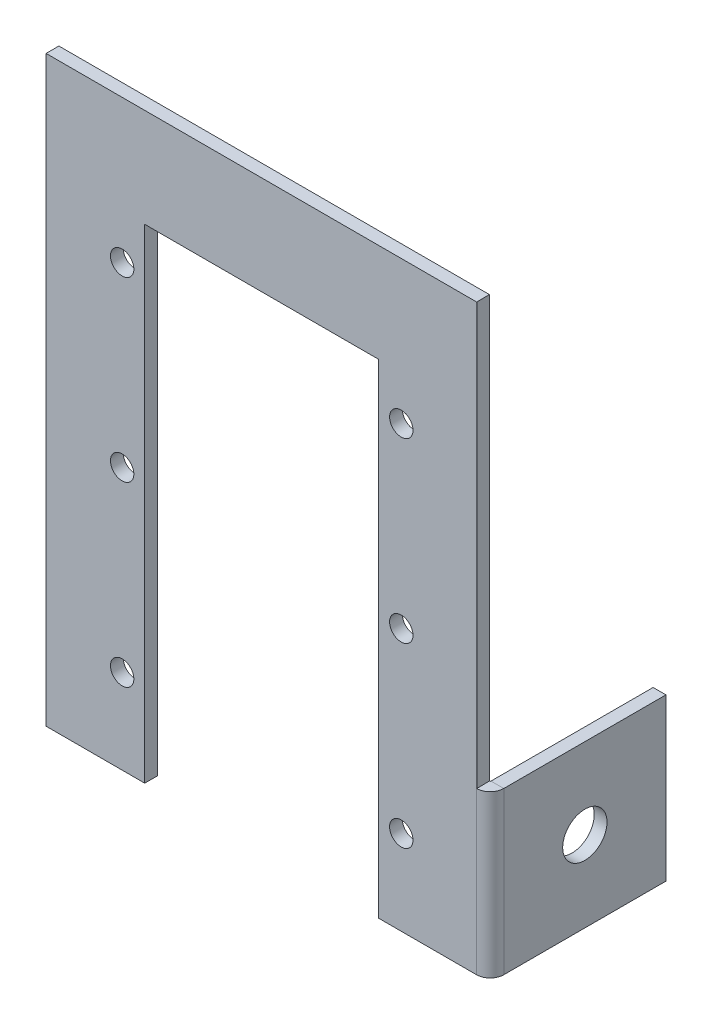
ISO-10303-21;
HEADER;
FILE_DESCRIPTION(('STEP AP214'),'2;1');
FILE_NAME('part.step','',(''),(''),'','','');
FILE_SCHEMA(('AUTOMOTIVE_DESIGN { 1 0 10303 214 1 1 1 1 }'));
ENDSEC;
DATA;
#1=APPLICATION_CONTEXT('core data for automotive mechanical design processes');
#2=APPLICATION_PROTOCOL_DEFINITION('international standard','automotive_design',2000,#1);
#3=PRODUCT_CONTEXT('',#1,'mechanical');
#4=PRODUCT('Part','Part','',(#3));
#5=PRODUCT_RELATED_PRODUCT_CATEGORY('part','',(#4));
#6=PRODUCT_DEFINITION_FORMATION('','',#4);
#7=PRODUCT_DEFINITION_CONTEXT('part definition',#1,'design');
#8=PRODUCT_DEFINITION('design','',#6,#7);
#9=PRODUCT_DEFINITION_SHAPE('','',#8);
#10=(LENGTH_UNIT() NAMED_UNIT(*) SI_UNIT(.MILLI.,.METRE.));
#11=(NAMED_UNIT(*) PLANE_ANGLE_UNIT() SI_UNIT($,.RADIAN.));
#12=(NAMED_UNIT(*) SI_UNIT($,.STERADIAN.) SOLID_ANGLE_UNIT());
#13=UNCERTAINTY_MEASURE_WITH_UNIT(LENGTH_MEASURE(1.E-05),#10,'distance_accuracy_value','');
#14=(GEOMETRIC_REPRESENTATION_CONTEXT(3) GLOBAL_UNCERTAINTY_ASSIGNED_CONTEXT((#13)) GLOBAL_UNIT_ASSIGNED_CONTEXT((#10,
#11,#12)) REPRESENTATION_CONTEXT('',''));
#15=CARTESIAN_POINT('',(0.,0.,0.));
#16=DIRECTION('',(0.,0.,1.));
#17=DIRECTION('',(1.,0.,0.));
#18=AXIS2_PLACEMENT_3D('',#15,#16,#17);
#19=CARTESIAN_POINT('',(26.7316212801133,-30.,8.2125));
#20=DIRECTION('',(0.,1.,0.));
#21=DIRECTION('',(1.,0.,0.));
#22=AXIS2_PLACEMENT_3D('',#19,#20,#21);
#23=PLANE('',#22);
#24=DIRECTION('',(0.,0.,1.));
#25=VECTOR('',#24,1.);
#26=CARTESIAN_POINT('',(26.7316212801133,-30.,8.2125));
#27=LINE('',#26,#25);
#28=CARTESIAN_POINT('',(26.7316212801132,-30.,-21.7875));
#29=VERTEX_POINT('',#28);
#30=CARTESIAN_POINT('',(26.7316212801132,-30.,-1.68749999999999));
#31=VERTEX_POINT('',#30);
#32=EDGE_CURVE('E106',#29,#31,#27,.T.);
#33=ORIENTED_EDGE('',*,*,#32,.T.);
#34=DIRECTION('',(1.,0.,0.));
#35=VECTOR('',#34,1.);
#36=CARTESIAN_POINT('',(26.7316212801132,-30.,-1.68749999999999));
#37=LINE('',#36,#35);
#38=CARTESIAN_POINT('',(28.3191212801132,-30.,-1.68750000000001));
#39=VERTEX_POINT('',#38);
#40=EDGE_CURVE('E12',#31,#39,#37,.T.);
#41=ORIENTED_EDGE('',*,*,#40,.T.);
#42=DIRECTION('',(0.,0.,1.));
#43=VECTOR('',#42,1.);
#44=CARTESIAN_POINT('',(28.3191212801133,-30.,8.2125));
#45=LINE('',#44,#43);
#46=CARTESIAN_POINT('',(28.3191212801132,-30.,-21.7875));
#47=VERTEX_POINT('',#46);
#48=EDGE_CURVE('E91',#47,#39,#45,.T.);
#49=ORIENTED_EDGE('',*,*,#48,.F.);
#50=DIRECTION('',(1.,0.,0.));
#51=VECTOR('',#50,1.);
#52=CARTESIAN_POINT('',(26.7316212801132,-30.,-21.7875));
#53=LINE('',#52,#51);
#54=EDGE_CURVE('E68',#29,#47,#53,.T.);
#55=ORIENTED_EDGE('',*,*,#54,.F.);
#56=EDGE_LOOP('',(#33,#41,#49,#55));
#57=FACE_BOUND('',#56,.T.);
#58=ADVANCED_FACE('F43',(#57),#23,.T.);
#59=CARTESIAN_POINT('',(26.7316212801132,-50.,-21.7875));
#60=DIRECTION('',(0.,-1.,0.));
#61=DIRECTION('',(0.,0.,-1.));
#62=AXIS2_PLACEMENT_3D('',#59,#60,#61);
#63=PLANE('',#62);
#64=DIRECTION('',(0.,0.,-1.));
#65=VECTOR('',#64,1.);
#66=CARTESIAN_POINT('',(28.3191212801132,-50.,-21.7875));
#67=LINE('',#66,#65);
#68=CARTESIAN_POINT('',(28.3191212801132,-50.,-1.68750000000001));
#69=VERTEX_POINT('',#68);
#70=CARTESIAN_POINT('',(28.3191212801132,-50.,-21.7875));
#71=VERTEX_POINT('',#70);
#72=EDGE_CURVE('E98',#69,#71,#67,.T.);
#73=ORIENTED_EDGE('',*,*,#72,.F.);
#74=DIRECTION('',(-1.,0.,0.));
#75=VECTOR('',#74,1.);
#76=CARTESIAN_POINT('',(26.7316212801132,-50.,-1.6875));
#77=LINE('',#76,#75);
#78=CARTESIAN_POINT('',(26.7316212801132,-50.,-1.6875));
#79=VERTEX_POINT('',#78);
#80=EDGE_CURVE('E109',#69,#79,#77,.T.);
#81=ORIENTED_EDGE('',*,*,#80,.T.);
#82=DIRECTION('',(0.,0.,-1.));
#83=VECTOR('',#82,1.);
#84=CARTESIAN_POINT('',(26.7316212801132,-50.,-21.7875));
#85=LINE('',#84,#83);
#86=CARTESIAN_POINT('',(26.7316212801132,-50.,-21.7875));
#87=VERTEX_POINT('',#86);
#88=EDGE_CURVE('E46',#79,#87,#85,.T.);
#89=ORIENTED_EDGE('',*,*,#88,.T.);
#90=DIRECTION('',(1.,0.,0.));
#91=VECTOR('',#90,1.);
#92=CARTESIAN_POINT('',(26.7316212801132,-50.,-21.7875));
#93=LINE('',#92,#91);
#94=EDGE_CURVE('E88',#87,#71,#93,.T.);
#95=ORIENTED_EDGE('',*,*,#94,.T.);
#96=EDGE_LOOP('',(#73,#81,#89,#95));
#97=FACE_BOUND('',#96,.T.);
#98=ADVANCED_FACE('F116',(#97),#63,.T.);
#99=CARTESIAN_POINT('',(26.7316212801134,0.,34.9441212801132));
#100=DIRECTION('',(-1.,0.,0.));
#101=DIRECTION('',(0.,0.,1.));
#102=AXIS2_PLACEMENT_3D('',#99,#100,#101);
#103=PLANE('',#102);
#104=CARTESIAN_POINT('',(26.7316212801132,-40.,-11.7375));
#105=DIRECTION('',(-1.,0.,0.));
#106=DIRECTION('',(0.,0.,1.));
#107=AXIS2_PLACEMENT_3D('',#104,#105,#106);
#108=CIRCLE('',#107,2.75);
#109=CARTESIAN_POINT('',(26.7316212801132,-40.,-8.98749999999999));
#110=VERTEX_POINT('',#109);
#111=EDGE_CURVE('E147',#110,#110,#108,.T.);
#112=ORIENTED_EDGE('',*,*,#111,.F.);
#113=EDGE_LOOP('',(#112));
#114=FACE_BOUND('',#113,.T.);
#115=ORIENTED_EDGE('',*,*,#88,.F.);
#116=DIRECTION('',(0.,1.,0.));
#117=VECTOR('',#116,1.);
#118=CARTESIAN_POINT('',(26.7316212801132,0.,-1.68749999999999));
#119=LINE('',#118,#117);
#120=EDGE_CURVE('E87',#79,#31,#119,.T.);
#121=ORIENTED_EDGE('',*,*,#120,.T.);
#122=ORIENTED_EDGE('',*,*,#32,.F.);
#123=DIRECTION('',(0.,1.,0.));
#124=VECTOR('',#123,1.);
#125=CARTESIAN_POINT('',(26.7316212801132,-30.,-21.7875));
#126=LINE('',#125,#124);
#127=EDGE_CURVE('E86',#87,#29,#126,.T.);
#128=ORIENTED_EDGE('',*,*,#127,.F.);
#129=EDGE_LOOP('',(#115,#121,#122,#128));
#130=FACE_BOUND('',#129,.T.);
#131=ADVANCED_FACE('F120',(#114,#130),#103,.T.);
#132=CARTESIAN_POINT('',(26.7316212801132,-30.,-21.7875));
#133=DIRECTION('',(0.,0.,-1.));
#134=DIRECTION('',(-1.,0.,0.));
#135=AXIS2_PLACEMENT_3D('',#132,#133,#134);
#136=PLANE('',#135);
#137=DIRECTION('',(0.,1.,0.));
#138=VECTOR('',#137,1.);
#139=CARTESIAN_POINT('',(28.3191212801132,-30.,-21.7875));
#140=LINE('',#139,#138);
#141=EDGE_CURVE('E84',#71,#47,#140,.T.);
#142=ORIENTED_EDGE('',*,*,#141,.F.);
#143=ORIENTED_EDGE('',*,*,#94,.F.);
#144=ORIENTED_EDGE('',*,*,#127,.T.);
#145=ORIENTED_EDGE('',*,*,#54,.T.);
#146=EDGE_LOOP('',(#142,#143,#144,#145));
#147=FACE_BOUND('',#146,.T.);
#148=ADVANCED_FACE('F81',(#147),#136,.T.);
#149=CARTESIAN_POINT('',(28.3191212801134,0.,34.9441212801132));
#150=DIRECTION('',(-1.,0.,0.));
#151=DIRECTION('',(0.,0.,1.));
#152=AXIS2_PLACEMENT_3D('',#149,#150,#151);
#153=PLANE('',#152);
#154=CARTESIAN_POINT('',(28.3191212801133,-40.,-11.7375));
#155=DIRECTION('',(-1.,0.,0.));
#156=DIRECTION('',(0.,0.,1.));
#157=AXIS2_PLACEMENT_3D('',#154,#155,#156);
#158=CIRCLE('',#157,2.75);
#159=CARTESIAN_POINT('',(28.3191212801133,-40.,-8.9875));
#160=VERTEX_POINT('',#159);
#161=EDGE_CURVE('E159',#160,#160,#158,.T.);
#162=ORIENTED_EDGE('',*,*,#161,.T.);
#163=EDGE_LOOP('',(#162));
#164=FACE_BOUND('',#163,.T.);
#165=DIRECTION('',(0.,1.,0.));
#166=VECTOR('',#165,1.);
#167=CARTESIAN_POINT('',(28.3191212801132,0.,-1.68749999999999));
#168=LINE('',#167,#166);
#169=EDGE_CURVE('E51',#69,#39,#168,.T.);
#170=ORIENTED_EDGE('',*,*,#169,.F.);
#171=ORIENTED_EDGE('',*,*,#72,.T.);
#172=ORIENTED_EDGE('',*,*,#141,.T.);
#173=ORIENTED_EDGE('',*,*,#48,.T.);
#174=EDGE_LOOP('',(#170,#171,#172,#173));
#175=FACE_BOUND('',#174,.T.);
#176=ADVANCED_FACE('F96',(#164,#175),#153,.F.);
#177=CARTESIAN_POINT('',(-26.7316212801132,22.2316212801132,-1.5875));
#178=DIRECTION('',(-1.,0.,0.));
#179=DIRECTION('',(0.,-1.,0.));
#180=AXIS2_PLACEMENT_3D('',#177,#178,#179);
#181=PLANE('',#180);
#182=DIRECTION('',(0.,-1.,0.));
#183=VECTOR('',#182,1.);
#184=CARTESIAN_POINT('',(-26.7316212801132,22.2316212801132,0.));
#185=LINE('',#184,#183);
#186=CARTESIAN_POINT('',(-26.7316212801132,22.2316212801132,0.));
#187=VERTEX_POINT('',#186);
#188=CARTESIAN_POINT('',(-26.7316212801132,-50.,0.));
#189=VERTEX_POINT('',#188);
#190=EDGE_CURVE('E184',#187,#189,#185,.T.);
#191=ORIENTED_EDGE('',*,*,#190,.F.);
#192=DIRECTION('',(0.,0.,1.));
#193=VECTOR('',#192,1.);
#194=CARTESIAN_POINT('',(-26.7316212801132,22.2316212801132,-1.5875));
#195=LINE('',#194,#193);
#196=CARTESIAN_POINT('',(-26.7316212801132,22.2316212801132,-1.5875));
#197=VERTEX_POINT('',#196);
#198=EDGE_CURVE('E101',#197,#187,#195,.T.);
#199=ORIENTED_EDGE('',*,*,#198,.F.);
#200=DIRECTION('',(0.,-1.,0.));
#201=VECTOR('',#200,1.);
#202=CARTESIAN_POINT('',(-26.7316212801132,22.2316212801132,-1.5875));
#203=LINE('',#202,#201);
#204=CARTESIAN_POINT('',(-26.7316212801132,-50.,-1.5875));
#205=VERTEX_POINT('',#204);
#206=EDGE_CURVE('E226',#197,#205,#203,.T.);
#207=ORIENTED_EDGE('',*,*,#206,.T.);
#208=DIRECTION('',(0.,0.,1.));
#209=VECTOR('',#208,1.);
#210=CARTESIAN_POINT('',(-26.7316212801132,-50.,-1.5875));
#211=LINE('',#210,#209);
#212=EDGE_CURVE('E223',#205,#189,#211,.T.);
#213=ORIENTED_EDGE('',*,*,#212,.T.);
#214=EDGE_LOOP('',(#191,#199,#207,#213));
#215=FACE_BOUND('',#214,.T.);
#216=ADVANCED_FACE('F324',(#215),#181,.T.);
#217=CARTESIAN_POINT('',(-26.7316212801132,-50.,-1.5875));
#218=DIRECTION('',(0.,-1.,0.));
#219=DIRECTION('',(1.,0.,0.));
#220=AXIS2_PLACEMENT_3D('',#217,#218,#219);
#221=PLANE('',#220);
#222=DIRECTION('',(1.,0.,0.));
#223=VECTOR('',#222,1.);
#224=CARTESIAN_POINT('',(-26.7316212801132,-50.,0.));
#225=LINE('',#224,#223);
#226=CARTESIAN_POINT('',(-14.5,-50.,0.));
#227=VERTEX_POINT('',#226);
#228=EDGE_CURVE('E181',#189,#227,#225,.T.);
#229=ORIENTED_EDGE('',*,*,#228,.F.);
#230=ORIENTED_EDGE('',*,*,#212,.F.);
#231=DIRECTION('',(1.,0.,0.));
#232=VECTOR('',#231,1.);
#233=CARTESIAN_POINT('',(-26.7316212801132,-50.,-1.5875));
#234=LINE('',#233,#232);
#235=CARTESIAN_POINT('',(-14.5,-50.,-1.5875));
#236=VERTEX_POINT('',#235);
#237=EDGE_CURVE('E220',#205,#236,#234,.T.);
#238=ORIENTED_EDGE('',*,*,#237,.T.);
#239=DIRECTION('',(0.,0.,1.));
#240=VECTOR('',#239,1.);
#241=CARTESIAN_POINT('',(-14.5,-50.,-1.5875));
#242=LINE('',#241,#240);
#243=EDGE_CURVE('E217',#236,#227,#242,.T.);
#244=ORIENTED_EDGE('',*,*,#243,.T.);
#245=EDGE_LOOP('',(#229,#230,#238,#244));
#246=FACE_BOUND('',#245,.T.);
#247=ADVANCED_FACE('F321',(#246),#221,.T.);
#248=CARTESIAN_POINT('',(-14.5,-50.,-1.5875));
#249=DIRECTION('',(1.,0.,0.));
#250=DIRECTION('',(0.,0.,-1.));
#251=AXIS2_PLACEMENT_3D('',#248,#249,#250);
#252=PLANE('',#251);
#253=DIRECTION('',(0.,1.,0.));
#254=VECTOR('',#253,1.);
#255=CARTESIAN_POINT('',(-14.5,-50.,0.));
#256=LINE('',#255,#254);
#257=CARTESIAN_POINT('',(-14.5,10.,0.));
#258=VERTEX_POINT('',#257);
#259=EDGE_CURVE('E178',#227,#258,#256,.T.);
#260=ORIENTED_EDGE('',*,*,#259,.F.);
#261=ORIENTED_EDGE('',*,*,#243,.F.);
#262=DIRECTION('',(0.,1.,0.));
#263=VECTOR('',#262,1.);
#264=CARTESIAN_POINT('',(-14.5,-50.,-1.5875));
#265=LINE('',#264,#263);
#266=CARTESIAN_POINT('',(-14.5,10.,-1.5875));
#267=VERTEX_POINT('',#266);
#268=EDGE_CURVE('E214',#236,#267,#265,.T.);
#269=ORIENTED_EDGE('',*,*,#268,.T.);
#270=DIRECTION('',(0.,0.,1.));
#271=VECTOR('',#270,1.);
#272=CARTESIAN_POINT('',(-14.5,10.,-1.5875));
#273=LINE('',#272,#271);
#274=EDGE_CURVE('E211',#267,#258,#273,.T.);
#275=ORIENTED_EDGE('',*,*,#274,.T.);
#276=EDGE_LOOP('',(#260,#261,#269,#275));
#277=FACE_BOUND('',#276,.T.);
#278=ADVANCED_FACE('F318',(#277),#252,.T.);
#279=CARTESIAN_POINT('',(-14.5,10.,-1.5875));
#280=DIRECTION('',(0.,-1.,0.));
#281=DIRECTION('',(0.,0.,-1.));
#282=AXIS2_PLACEMENT_3D('',#279,#280,#281);
#283=PLANE('',#282);
#284=DIRECTION('',(1.,0.,0.));
#285=VECTOR('',#284,1.);
#286=CARTESIAN_POINT('',(-14.5,10.,0.));
#287=LINE('',#286,#285);
#288=CARTESIAN_POINT('',(14.5,10.,0.));
#289=VERTEX_POINT('',#288);
#290=EDGE_CURVE('E175',#258,#289,#287,.T.);
#291=ORIENTED_EDGE('',*,*,#290,.F.);
#292=ORIENTED_EDGE('',*,*,#274,.F.);
#293=DIRECTION('',(1.,0.,0.));
#294=VECTOR('',#293,1.);
#295=CARTESIAN_POINT('',(-14.5,10.,-1.5875));
#296=LINE('',#295,#294);
#297=CARTESIAN_POINT('',(14.5,10.,-1.5875));
#298=VERTEX_POINT('',#297);
#299=EDGE_CURVE('E208',#267,#298,#296,.T.);
#300=ORIENTED_EDGE('',*,*,#299,.T.);
#301=DIRECTION('',(0.,0.,1.));
#302=VECTOR('',#301,1.);
#303=CARTESIAN_POINT('',(14.5,10.,-1.5875));
#304=LINE('',#303,#302);
#305=EDGE_CURVE('E205',#298,#289,#304,.T.);
#306=ORIENTED_EDGE('',*,*,#305,.T.);
#307=EDGE_LOOP('',(#291,#292,#300,#306));
#308=FACE_BOUND('',#307,.T.);
#309=ADVANCED_FACE('F313',(#308),#283,.T.);
#310=CARTESIAN_POINT('',(14.5,10.,-1.5875));
#311=DIRECTION('',(-1.,0.,0.));
#312=DIRECTION('',(0.,-1.,0.));
#313=AXIS2_PLACEMENT_3D('',#310,#311,#312);
#314=PLANE('',#313);
#315=DIRECTION('',(0.,-1.,0.));
#316=VECTOR('',#315,1.);
#317=CARTESIAN_POINT('',(14.5,10.,0.));
#318=LINE('',#317,#316);
#319=CARTESIAN_POINT('',(14.5,-50.,0.));
#320=VERTEX_POINT('',#319);
#321=EDGE_CURVE('E172',#289,#320,#318,.T.);
#322=ORIENTED_EDGE('',*,*,#321,.F.);
#323=ORIENTED_EDGE('',*,*,#305,.F.);
#324=DIRECTION('',(0.,-1.,0.));
#325=VECTOR('',#324,1.);
#326=CARTESIAN_POINT('',(14.5,10.,-1.5875));
#327=LINE('',#326,#325);
#328=CARTESIAN_POINT('',(14.5,-50.,-1.5875));
#329=VERTEX_POINT('',#328);
#330=EDGE_CURVE('E202',#298,#329,#327,.T.);
#331=ORIENTED_EDGE('',*,*,#330,.T.);
#332=DIRECTION('',(0.,0.,1.));
#333=VECTOR('',#332,1.);
#334=CARTESIAN_POINT('',(14.5,-50.,-1.5875));
#335=LINE('',#334,#333);
#336=EDGE_CURVE('E199',#329,#320,#335,.T.);
#337=ORIENTED_EDGE('',*,*,#336,.T.);
#338=EDGE_LOOP('',(#322,#323,#331,#337));
#339=FACE_BOUND('',#338,.T.);
#340=ADVANCED_FACE('F310',(#339),#314,.T.);
#341=CARTESIAN_POINT('',(0.,0.,-1.5875));
#342=DIRECTION('',(0.,0.,-1.));
#343=DIRECTION('',(-1.,0.,0.));
#344=AXIS2_PLACEMENT_3D('',#341,#342,#343);
#345=PLANE('',#344);
#346=CARTESIAN_POINT('',(17.3,4.49999999999998,-1.5875));
#347=DIRECTION('',(0.,0.,-1.));
#348=DIRECTION('',(-1.,0.,0.));
#349=AXIS2_PLACEMENT_3D('',#346,#347,#348);
#350=CIRCLE('',#349,1.45);
#351=CARTESIAN_POINT('',(15.85,4.49999999999998,-1.5875));
#352=VERTEX_POINT('',#351);
#353=EDGE_CURVE('E605',#352,#352,#350,.T.);
#354=ORIENTED_EDGE('',*,*,#353,.F.);
#355=EDGE_LOOP('',(#354));
#356=FACE_BOUND('',#355,.T.);
#357=CARTESIAN_POINT('',(17.3,-17.5,-1.5875));
#358=DIRECTION('',(0.,0.,-1.));
#359=DIRECTION('',(-1.,0.,0.));
#360=AXIS2_PLACEMENT_3D('',#357,#358,#359);
#361=CIRCLE('',#360,1.45);
#362=CARTESIAN_POINT('',(15.85,-17.5,-1.5875));
#363=VERTEX_POINT('',#362);
#364=EDGE_CURVE('E607',#363,#363,#361,.T.);
#365=ORIENTED_EDGE('',*,*,#364,.F.);
#366=EDGE_LOOP('',(#365));
#367=FACE_BOUND('',#366,.T.);
#368=CARTESIAN_POINT('',(17.3,-39.5,-1.5875));
#369=DIRECTION('',(0.,0.,-1.));
#370=DIRECTION('',(-1.,0.,0.));
#371=AXIS2_PLACEMENT_3D('',#368,#369,#370);
#372=CIRCLE('',#371,1.45);
#373=CARTESIAN_POINT('',(15.85,-39.5,-1.5875));
#374=VERTEX_POINT('',#373);
#375=EDGE_CURVE('E615',#374,#374,#372,.T.);
#376=ORIENTED_EDGE('',*,*,#375,.F.);
#377=EDGE_LOOP('',(#376));
#378=FACE_BOUND('',#377,.T.);
#379=CARTESIAN_POINT('',(-17.3,-39.5,-1.5875));
#380=DIRECTION('',(0.,0.,-1.));
#381=DIRECTION('',(-1.,0.,0.));
#382=AXIS2_PLACEMENT_3D('',#379,#380,#381);
#383=CIRCLE('',#382,1.45);
#384=CARTESIAN_POINT('',(-18.75,-39.5,-1.5875));
#385=VERTEX_POINT('',#384);
#386=EDGE_CURVE('E621',#385,#385,#383,.T.);
#387=ORIENTED_EDGE('',*,*,#386,.F.);
#388=EDGE_LOOP('',(#387));
#389=FACE_BOUND('',#388,.T.);
#390=CARTESIAN_POINT('',(-17.3,-17.5,-1.5875));
#391=DIRECTION('',(0.,0.,-1.));
#392=DIRECTION('',(-1.,0.,0.));
#393=AXIS2_PLACEMENT_3D('',#390,#391,#392);
#394=CIRCLE('',#393,1.45);
#395=CARTESIAN_POINT('',(-18.75,-17.5,-1.5875));
#396=VERTEX_POINT('',#395);
#397=EDGE_CURVE('E627',#396,#396,#394,.T.);
#398=ORIENTED_EDGE('',*,*,#397,.F.);
#399=EDGE_LOOP('',(#398));
#400=FACE_BOUND('',#399,.T.);
#401=CARTESIAN_POINT('',(-17.3,4.49999999999998,-1.5875));
#402=DIRECTION('',(0.,0.,-1.));
#403=DIRECTION('',(-1.,0.,0.));
#404=AXIS2_PLACEMENT_3D('',#401,#402,#403);
#405=CIRCLE('',#404,1.45);
#406=CARTESIAN_POINT('',(-18.75,4.49999999999998,-1.5875));
#407=VERTEX_POINT('',#406);
#408=EDGE_CURVE('E633',#407,#407,#405,.T.);
#409=ORIENTED_EDGE('',*,*,#408,.F.);
#410=EDGE_LOOP('',(#409));
#411=FACE_BOUND('',#410,.T.);
#412=DIRECTION('',(0.,1.,0.));
#413=VECTOR('',#412,1.);
#414=CARTESIAN_POINT('',(26.6316212801132,0.,-1.5875));
#415=LINE('',#414,#413);
#416=CARTESIAN_POINT('',(26.6316212801132,-50.,-1.5875));
#417=VERTEX_POINT('',#416);
#418=CARTESIAN_POINT('',(26.6316212801132,22.2316212801132,-1.5875));
#419=VERTEX_POINT('',#418);
#420=EDGE_CURVE('E164',#417,#419,#415,.T.);
#421=ORIENTED_EDGE('',*,*,#420,.F.);
#422=DIRECTION('',(1.,0.,0.));
#423=VECTOR('',#422,1.);
#424=CARTESIAN_POINT('',(56.7316212801132,-50.,-1.5875));
#425=LINE('',#424,#423);
#426=EDGE_CURVE('E196',#329,#417,#425,.T.);
#427=ORIENTED_EDGE('',*,*,#426,.F.);
#428=ORIENTED_EDGE('',*,*,#330,.F.);
#429=ORIENTED_EDGE('',*,*,#299,.F.);
#430=ORIENTED_EDGE('',*,*,#268,.F.);
#431=ORIENTED_EDGE('',*,*,#237,.F.);
#432=ORIENTED_EDGE('',*,*,#206,.F.);
#433=DIRECTION('',(-1.,0.,0.));
#434=VECTOR('',#433,1.);
#435=CARTESIAN_POINT('',(26.7316212801132,22.2316212801132,-1.5875));
#436=LINE('',#435,#434);
#437=EDGE_CURVE('E169',#419,#197,#436,.T.);
#438=ORIENTED_EDGE('',*,*,#437,.F.);
#439=EDGE_LOOP('',(#421,#427,#428,#429,#430,#431,#432,#438));
#440=FACE_BOUND('',#439,.T.);
#441=ADVANCED_FACE('F307',(#356,#367,#378,#389,#400,#411,#440),#345,.T.);
#442=CARTESIAN_POINT('',(56.7316212801132,-50.,-1.5875));
#443=DIRECTION('',(0.,-1.,0.));
#444=DIRECTION('',(1.,0.,0.));
#445=AXIS2_PLACEMENT_3D('',#442,#443,#444);
#446=PLANE('',#445);
#447=DIRECTION('',(0.,0.,-1.));
#448=VECTOR('',#447,1.);
#449=CARTESIAN_POINT('',(26.6316212801132,-50.,-1.5875));
#450=LINE('',#449,#448);
#451=CARTESIAN_POINT('',(26.6316212801132,-50.,0.));
#452=VERTEX_POINT('',#451);
#453=EDGE_CURVE('E136',#452,#417,#450,.T.);
#454=ORIENTED_EDGE('',*,*,#453,.F.);
#455=DIRECTION('',(1.,0.,0.));
#456=VECTOR('',#455,1.);
#457=CARTESIAN_POINT('',(56.7316212801132,-50.,0.));
#458=LINE('',#457,#456);
#459=EDGE_CURVE('E193',#320,#452,#458,.T.);
#460=ORIENTED_EDGE('',*,*,#459,.F.);
#461=ORIENTED_EDGE('',*,*,#336,.F.);
#462=ORIENTED_EDGE('',*,*,#426,.T.);
#463=EDGE_LOOP('',(#454,#460,#461,#462));
#464=FACE_BOUND('',#463,.T.);
#465=ADVANCED_FACE('F304',(#464),#446,.T.);
#466=CARTESIAN_POINT('',(0.,0.,0.));
#467=DIRECTION('',(0.,0.,-1.));
#468=DIRECTION('',(-1.,0.,0.));
#469=AXIS2_PLACEMENT_3D('',#466,#467,#468);
#470=PLANE('',#469);
#471=CARTESIAN_POINT('',(17.3,4.49999999999998,0.));
#472=DIRECTION('',(0.,0.,-1.));
#473=DIRECTION('',(-1.,0.,0.));
#474=AXIS2_PLACEMENT_3D('',#471,#472,#473);
#475=CIRCLE('',#474,1.45);
#476=CARTESIAN_POINT('',(15.85,4.49999999999998,0.));
#477=VERTEX_POINT('',#476);
#478=EDGE_CURVE('E602',#477,#477,#475,.T.);
#479=ORIENTED_EDGE('',*,*,#478,.T.);
#480=EDGE_LOOP('',(#479));
#481=FACE_BOUND('',#480,.T.);
#482=CARTESIAN_POINT('',(17.3,-17.5,0.));
#483=DIRECTION('',(0.,0.,-1.));
#484=DIRECTION('',(-1.,0.,0.));
#485=AXIS2_PLACEMENT_3D('',#482,#483,#484);
#486=CIRCLE('',#485,1.45);
#487=CARTESIAN_POINT('',(15.85,-17.5,0.));
#488=VERTEX_POINT('',#487);
#489=EDGE_CURVE('E612',#488,#488,#486,.T.);
#490=ORIENTED_EDGE('',*,*,#489,.T.);
#491=EDGE_LOOP('',(#490));
#492=FACE_BOUND('',#491,.T.);
#493=CARTESIAN_POINT('',(17.3,-39.5,0.));
#494=DIRECTION('',(0.,0.,-1.));
#495=DIRECTION('',(-1.,0.,0.));
#496=AXIS2_PLACEMENT_3D('',#493,#494,#495);
#497=CIRCLE('',#496,1.45);
#498=CARTESIAN_POINT('',(15.85,-39.5,0.));
#499=VERTEX_POINT('',#498);
#500=EDGE_CURVE('E618',#499,#499,#497,.T.);
#501=ORIENTED_EDGE('',*,*,#500,.T.);
#502=EDGE_LOOP('',(#501));
#503=FACE_BOUND('',#502,.T.);
#504=CARTESIAN_POINT('',(-17.3,-39.5,0.));
#505=DIRECTION('',(0.,0.,-1.));
#506=DIRECTION('',(-1.,0.,0.));
#507=AXIS2_PLACEMENT_3D('',#504,#505,#506);
#508=CIRCLE('',#507,1.45);
#509=CARTESIAN_POINT('',(-18.75,-39.5,0.));
#510=VERTEX_POINT('',#509);
#511=EDGE_CURVE('E624',#510,#510,#508,.T.);
#512=ORIENTED_EDGE('',*,*,#511,.T.);
#513=EDGE_LOOP('',(#512));
#514=FACE_BOUND('',#513,.T.);
#515=CARTESIAN_POINT('',(-17.3,-17.5,0.));
#516=DIRECTION('',(0.,0.,-1.));
#517=DIRECTION('',(-1.,0.,0.));
#518=AXIS2_PLACEMENT_3D('',#515,#516,#517);
#519=CIRCLE('',#518,1.45);
#520=CARTESIAN_POINT('',(-18.75,-17.5,0.));
#521=VERTEX_POINT('',#520);
#522=EDGE_CURVE('E630',#521,#521,#519,.T.);
#523=ORIENTED_EDGE('',*,*,#522,.T.);
#524=EDGE_LOOP('',(#523));
#525=FACE_BOUND('',#524,.T.);
#526=CARTESIAN_POINT('',(-17.3,4.49999999999998,0.));
#527=DIRECTION('',(0.,0.,-1.));
#528=DIRECTION('',(-1.,0.,0.));
#529=AXIS2_PLACEMENT_3D('',#526,#527,#528);
#530=CIRCLE('',#529,1.45);
#531=CARTESIAN_POINT('',(-18.75,4.49999999999998,0.));
#532=VERTEX_POINT('',#531);
#533=EDGE_CURVE('E636',#532,#532,#530,.T.);
#534=ORIENTED_EDGE('',*,*,#533,.T.);
#535=EDGE_LOOP('',(#534));
#536=FACE_BOUND('',#535,.T.);
#537=ORIENTED_EDGE('',*,*,#459,.T.);
#538=DIRECTION('',(0.,1.,0.));
#539=VECTOR('',#538,1.);
#540=CARTESIAN_POINT('',(26.6316212801132,0.,0.));
#541=LINE('',#540,#539);
#542=CARTESIAN_POINT('',(26.6316212801132,22.2316212801132,0.));
#543=VERTEX_POINT('',#542);
#544=EDGE_CURVE('E190',#452,#543,#541,.T.);
#545=ORIENTED_EDGE('',*,*,#544,.T.);
#546=DIRECTION('',(-1.,0.,0.));
#547=VECTOR('',#546,1.);
#548=CARTESIAN_POINT('',(26.7316212801132,22.2316212801132,0.));
#549=LINE('',#548,#547);
#550=EDGE_CURVE('E187',#543,#187,#549,.T.);
#551=ORIENTED_EDGE('',*,*,#550,.T.);
#552=ORIENTED_EDGE('',*,*,#190,.T.);
#553=ORIENTED_EDGE('',*,*,#228,.T.);
#554=ORIENTED_EDGE('',*,*,#259,.T.);
#555=ORIENTED_EDGE('',*,*,#290,.T.);
#556=ORIENTED_EDGE('',*,*,#321,.T.);
#557=EDGE_LOOP('',(#537,#545,#551,#552,#553,#554,#555,#556));
#558=FACE_BOUND('',#557,.T.);
#559=ADVANCED_FACE('F300',(#481,#492,#503,#514,#525,#536,#558),#470,.F.);
#560=CARTESIAN_POINT('',(26.7316212801132,22.2316212801132,-1.5875));
#561=DIRECTION('',(0.,1.,0.));
#562=DIRECTION('',(0.,0.,1.));
#563=AXIS2_PLACEMENT_3D('',#560,#561,#562);
#564=PLANE('',#563);
#565=DIRECTION('',(0.,0.,1.));
#566=VECTOR('',#565,1.);
#567=CARTESIAN_POINT('',(26.6316212801132,22.2316212801132,-1.5875));
#568=LINE('',#567,#566);
#569=EDGE_CURVE('E230',#419,#543,#568,.T.);
#570=ORIENTED_EDGE('',*,*,#569,.F.);
#571=ORIENTED_EDGE('',*,*,#437,.T.);
#572=ORIENTED_EDGE('',*,*,#198,.T.);
#573=ORIENTED_EDGE('',*,*,#550,.F.);
#574=EDGE_LOOP('',(#570,#571,#572,#573));
#575=FACE_BOUND('',#574,.T.);
#576=ADVANCED_FACE('F296',(#575),#564,.T.);
#577=CARTESIAN_POINT('',(26.6316212801132,-50.,-1.6875));
#578=DIRECTION('',(0.,1.,0.));
#579=DIRECTION('',(0.,0.,1.));
#580=AXIS2_PLACEMENT_3D('',#577,#578,#579);
#581=PLANE('',#580);
#582=ORIENTED_EDGE('',*,*,#80,.F.);
#583=CARTESIAN_POINT('',(26.6316212801132,-50.,-1.6875));
#584=DIRECTION('',(0.,-1.,0.));
#585=DIRECTION('',(1.,0.,0.));
#586=AXIS2_PLACEMENT_3D('',#583,#584,#585);
#587=CIRCLE('',#586,1.6875);
#588=EDGE_CURVE('E158',#69,#452,#587,.T.);
#589=ORIENTED_EDGE('',*,*,#588,.T.);
#590=ORIENTED_EDGE('',*,*,#453,.T.);
#591=CARTESIAN_POINT('',(26.6316212801132,-50.,-1.6875));
#592=DIRECTION('',(0.,-1.,0.));
#593=DIRECTION('',(0.,0.,1.));
#594=AXIS2_PLACEMENT_3D('',#591,#592,#593);
#595=CIRCLE('',#594,0.0999999999999997);
#596=EDGE_CURVE('E126',#79,#417,#595,.T.);
#597=ORIENTED_EDGE('',*,*,#596,.F.);
#598=EDGE_LOOP('',(#582,#589,#590,#597));
#599=FACE_BOUND('',#598,.T.);
#600=ADVANCED_FACE('F131',(#599),#581,.F.);
#601=CARTESIAN_POINT('',(26.6316212801132,22.2316212801132,-1.6875));
#602=DIRECTION('',(0.,-1.,0.));
#603=DIRECTION('',(0.,0.,-1.));
#604=AXIS2_PLACEMENT_3D('',#601,#602,#603);
#605=PLANE('',#604);
#606=ORIENTED_EDGE('',*,*,#569,.T.);
#607=CARTESIAN_POINT('',(26.6316212801132,22.2316212801132,-1.6875));
#608=DIRECTION('',(0.,-1.,0.));
#609=DIRECTION('',(1.,0.,0.));
#610=AXIS2_PLACEMENT_3D('',#607,#608,#609);
#611=CIRCLE('',#610,1.6875);
#612=CARTESIAN_POINT('',(26.6581273780768,22.2316212801132,-0.000208182687195906));
#613=VERTEX_POINT('',#612);
#614=EDGE_CURVE('E155',#543,#613,#611,.F.);
#615=ORIENTED_EDGE('',*,*,#614,.T.);
#616=DIRECTION('',(-0.0157073173117487,0.,-0.999876632481662));
#617=VECTOR('',#616,1.);
#618=CARTESIAN_POINT('',(26.6331920118444,22.2316212801132,-1.58751233675183));
#619=LINE('',#618,#617);
#620=CARTESIAN_POINT('',(26.6331920118444,22.2316212801132,-1.58751233675183));
#621=VERTEX_POINT('',#620);
#622=EDGE_CURVE('E161',#613,#621,#619,.T.);
#623=ORIENTED_EDGE('',*,*,#622,.T.);
#624=CARTESIAN_POINT('',(26.6316212801132,22.2316212801132,-1.6875));
#625=DIRECTION('',(0.,1.,0.));
#626=DIRECTION('',(0.,0.,-1.));
#627=AXIS2_PLACEMENT_3D('',#624,#625,#626);
#628=CIRCLE('',#627,0.1);
#629=EDGE_CURVE('E137',#419,#621,#628,.T.);
#630=ORIENTED_EDGE('',*,*,#629,.F.);
#631=EDGE_LOOP('',(#606,#615,#623,#630));
#632=FACE_BOUND('',#631,.T.);
#633=ADVANCED_FACE('F243',(#632),#605,.F.);
#634=CARTESIAN_POINT('',(26.6331920118444,-3.88418935994338,-1.58751233675183));
#635=DIRECTION('',(-0.999876632481661,0.,0.0157073173117847));
#636=DIRECTION('',(0.,-1.,0.));
#637=AXIS2_PLACEMENT_3D('',#634,#635,#636);
#638=PLANE('',#637);
#639=ORIENTED_EDGE('',*,*,#622,.F.);
#640=DIRECTION('',(0.,-1.,0.));
#641=VECTOR('',#640,1.);
#642=CARTESIAN_POINT('',(26.6581273780768,59.0536421748898,-0.000208182687196339));
#643=LINE('',#642,#641);
#644=CARTESIAN_POINT('',(26.6581273780768,-30.,-0.000208182687195906));
#645=VERTEX_POINT('',#644);
#646=EDGE_CURVE('E144',#613,#645,#643,.T.);
#647=ORIENTED_EDGE('',*,*,#646,.T.);
#648=DIRECTION('',(-0.0157073173117524,0.,-0.999876632481662));
#649=VECTOR('',#648,1.);
#650=CARTESIAN_POINT('',(26.6331920118444,-30.,-1.58751233675183));
#651=LINE('',#650,#649);
#652=CARTESIAN_POINT('',(26.6331920118444,-30.,-1.58751233675183));
#653=VERTEX_POINT('',#652);
#654=EDGE_CURVE('E152',#645,#653,#651,.T.);
#655=ORIENTED_EDGE('',*,*,#654,.T.);
#656=DIRECTION('',(0.,-1.,0.));
#657=VECTOR('',#656,1.);
#658=CARTESIAN_POINT('',(26.6331920118444,-30.,-1.58751233675183));
#659=LINE('',#658,#657);
#660=EDGE_CURVE('E141',#621,#653,#659,.T.);
#661=ORIENTED_EDGE('',*,*,#660,.F.);
#662=EDGE_LOOP('',(#639,#647,#655,#661));
#663=FACE_BOUND('',#662,.T.);
#664=ADVANCED_FACE('F251',(#663),#638,.F.);
#665=CARTESIAN_POINT('',(26.6316212801132,-30.,-1.6875));
#666=DIRECTION('',(0.,-1.,0.));
#667=DIRECTION('',(0.,0.,-1.));
#668=AXIS2_PLACEMENT_3D('',#665,#666,#667);
#669=PLANE('',#668);
#670=CARTESIAN_POINT('',(26.6316212801132,-30.,-1.6875));
#671=DIRECTION('',(0.,-1.,0.));
#672=DIRECTION('',(1.,0.,0.));
#673=AXIS2_PLACEMENT_3D('',#670,#671,#672);
#674=CIRCLE('',#673,1.6875);
#675=EDGE_CURVE('E138',#645,#39,#674,.F.);
#676=ORIENTED_EDGE('',*,*,#675,.T.);
#677=ORIENTED_EDGE('',*,*,#40,.F.);
#678=CARTESIAN_POINT('',(26.6316212801132,-30.,-1.6875));
#679=DIRECTION('',(0.,1.,0.));
#680=DIRECTION('',(0.,0.,-1.));
#681=AXIS2_PLACEMENT_3D('',#678,#679,#680);
#682=CIRCLE('',#681,0.0999999999999997);
#683=EDGE_CURVE('E59',#653,#31,#682,.T.);
#684=ORIENTED_EDGE('',*,*,#683,.F.);
#685=ORIENTED_EDGE('',*,*,#654,.F.);
#686=EDGE_LOOP('',(#676,#677,#684,#685));
#687=FACE_BOUND('',#686,.T.);
#688=ADVANCED_FACE('F260',(#687),#669,.F.);
#689=CARTESIAN_POINT('',(26.6316212801132,59.0536421748898,-1.6875));
#690=DIRECTION('',(0.,-1.,0.));
#691=DIRECTION('',(1.,0.,0.));
#692=AXIS2_PLACEMENT_3D('',#689,#690,#691);
#693=CYLINDRICAL_SURFACE('',#692,0.1);
#694=ORIENTED_EDGE('',*,*,#660,.T.);
#695=ORIENTED_EDGE('',*,*,#683,.T.);
#696=ORIENTED_EDGE('',*,*,#120,.F.);
#697=ORIENTED_EDGE('',*,*,#596,.T.);
#698=ORIENTED_EDGE('',*,*,#420,.T.);
#699=ORIENTED_EDGE('',*,*,#629,.T.);
#700=EDGE_LOOP('',(#694,#695,#696,#697,#698,#699));
#701=FACE_BOUND('',#700,.T.);
#702=ADVANCED_FACE('F123',(#701),#693,.F.);
#703=CARTESIAN_POINT('',(26.6316212801132,59.0536421748898,-1.6875));
#704=DIRECTION('',(0.,-1.,0.));
#705=DIRECTION('',(1.,0.,0.));
#706=AXIS2_PLACEMENT_3D('',#703,#704,#705);
#707=CYLINDRICAL_SURFACE('',#706,1.6875);
#708=ORIENTED_EDGE('',*,*,#646,.F.);
#709=ORIENTED_EDGE('',*,*,#614,.F.);
#710=ORIENTED_EDGE('',*,*,#544,.F.);
#711=ORIENTED_EDGE('',*,*,#588,.F.);
#712=ORIENTED_EDGE('',*,*,#169,.T.);
#713=ORIENTED_EDGE('',*,*,#675,.F.);
#714=EDGE_LOOP('',(#708,#709,#710,#711,#712,#713));
#715=FACE_BOUND('',#714,.T.);
#716=ADVANCED_FACE('F255',(#715),#707,.T.);
#717=CARTESIAN_POINT('',(28.3191212801133,-40.,-11.7375));
#718=DIRECTION('',(-1.,0.,0.));
#719=DIRECTION('',(0.,0.,1.));
#720=AXIS2_PLACEMENT_3D('',#717,#718,#719);
#721=CYLINDRICAL_SURFACE('',#720,2.75);
#722=ORIENTED_EDGE('',*,*,#161,.F.);
#723=EDGE_LOOP('',(#722));
#724=FACE_BOUND('',#723,.T.);
#725=ORIENTED_EDGE('',*,*,#111,.T.);
#726=EDGE_LOOP('',(#725));
#727=FACE_BOUND('',#726,.T.);
#728=ADVANCED_FACE('F427',(#724,#727),#721,.F.);
#729=CARTESIAN_POINT('',(-17.3,4.49999999999998,-1.5875));
#730=DIRECTION('',(0.,0.,-1.));
#731=DIRECTION('',(-1.,0.,0.));
#732=AXIS2_PLACEMENT_3D('',#729,#730,#731);
#733=CYLINDRICAL_SURFACE('',#732,1.45);
#734=ORIENTED_EDGE('',*,*,#533,.F.);
#735=EDGE_LOOP('',(#734));
#736=FACE_BOUND('',#735,.T.);
#737=ORIENTED_EDGE('',*,*,#408,.T.);
#738=EDGE_LOOP('',(#737));
#739=FACE_BOUND('',#738,.T.);
#740=ADVANCED_FACE('F434',(#736,#739),#733,.F.);
#741=CARTESIAN_POINT('',(-17.3,-17.5,-1.5875));
#742=DIRECTION('',(0.,0.,-1.));
#743=DIRECTION('',(-1.,0.,0.));
#744=AXIS2_PLACEMENT_3D('',#741,#742,#743);
#745=CYLINDRICAL_SURFACE('',#744,1.45);
#746=ORIENTED_EDGE('',*,*,#522,.F.);
#747=EDGE_LOOP('',(#746));
#748=FACE_BOUND('',#747,.T.);
#749=ORIENTED_EDGE('',*,*,#397,.T.);
#750=EDGE_LOOP('',(#749));
#751=FACE_BOUND('',#750,.T.);
#752=ADVANCED_FACE('F442',(#748,#751),#745,.F.);
#753=CARTESIAN_POINT('',(-17.3,-39.5,-1.5875));
#754=DIRECTION('',(0.,0.,-1.));
#755=DIRECTION('',(-1.,0.,0.));
#756=AXIS2_PLACEMENT_3D('',#753,#754,#755);
#757=CYLINDRICAL_SURFACE('',#756,1.45);
#758=ORIENTED_EDGE('',*,*,#511,.F.);
#759=EDGE_LOOP('',(#758));
#760=FACE_BOUND('',#759,.T.);
#761=ORIENTED_EDGE('',*,*,#386,.T.);
#762=EDGE_LOOP('',(#761));
#763=FACE_BOUND('',#762,.T.);
#764=ADVANCED_FACE('F450',(#760,#763),#757,.F.);
#765=CARTESIAN_POINT('',(17.3,-39.5,-1.5875));
#766=DIRECTION('',(0.,0.,-1.));
#767=DIRECTION('',(-1.,0.,0.));
#768=AXIS2_PLACEMENT_3D('',#765,#766,#767);
#769=CYLINDRICAL_SURFACE('',#768,1.45);
#770=ORIENTED_EDGE('',*,*,#500,.F.);
#771=EDGE_LOOP('',(#770));
#772=FACE_BOUND('',#771,.T.);
#773=ORIENTED_EDGE('',*,*,#375,.T.);
#774=EDGE_LOOP('',(#773));
#775=FACE_BOUND('',#774,.T.);
#776=ADVANCED_FACE('F458',(#772,#775),#769,.F.);
#777=CARTESIAN_POINT('',(17.3,-17.5,-1.5875));
#778=DIRECTION('',(0.,0.,-1.));
#779=DIRECTION('',(-1.,0.,0.));
#780=AXIS2_PLACEMENT_3D('',#777,#778,#779);
#781=CYLINDRICAL_SURFACE('',#780,1.45);
#782=ORIENTED_EDGE('',*,*,#489,.F.);
#783=EDGE_LOOP('',(#782));
#784=FACE_BOUND('',#783,.T.);
#785=ORIENTED_EDGE('',*,*,#364,.T.);
#786=EDGE_LOOP('',(#785));
#787=FACE_BOUND('',#786,.T.);
#788=ADVANCED_FACE('F466',(#784,#787),#781,.F.);
#789=CARTESIAN_POINT('',(17.3,4.49999999999998,-1.5875));
#790=DIRECTION('',(0.,0.,-1.));
#791=DIRECTION('',(-1.,0.,0.));
#792=AXIS2_PLACEMENT_3D('',#789,#790,#791);
#793=CYLINDRICAL_SURFACE('',#792,1.45);
#794=ORIENTED_EDGE('',*,*,#478,.F.);
#795=EDGE_LOOP('',(#794));
#796=FACE_BOUND('',#795,.T.);
#797=ORIENTED_EDGE('',*,*,#353,.T.);
#798=EDGE_LOOP('',(#797));
#799=FACE_BOUND('',#798,.T.);
#800=ADVANCED_FACE('F474',(#796,#799),#793,.F.);
#801=CLOSED_SHELL('',(#58,#98,#131,#148,#176,#216,#247,#278,#309,#340,#441,#465,#559,#576,#600,
#633,#664,#688,#702,#716,#728,#740,#752,#764,#776,#788,#800));
#802=MANIFOLD_SOLID_BREP('B2',#801);
#803=ADVANCED_BREP_SHAPE_REPRESENTATION('',(#18,#802),#14);
#804=SHAPE_DEFINITION_REPRESENTATION(#9,#803);
ENDSEC;
END-ISO-10303-21;
